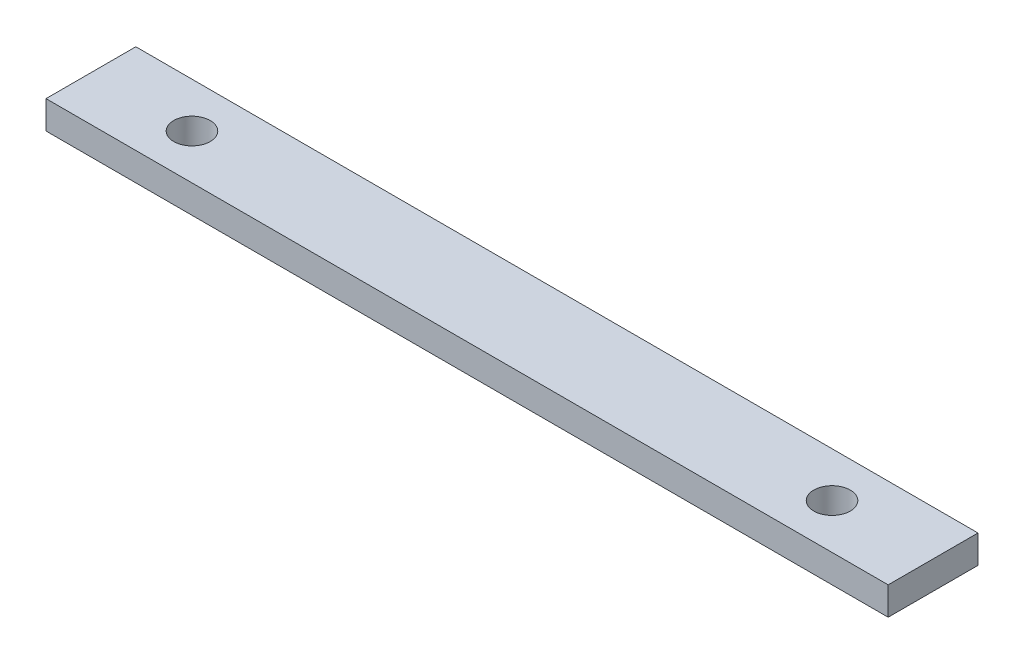
ISO-10303-21;
HEADER;
FILE_DESCRIPTION(('STEP AP214'),'2;1');
FILE_NAME('part.step','',(''),(''),'','','');
FILE_SCHEMA(('AUTOMOTIVE_DESIGN { 1 0 10303 214 1 1 1 1 }'));
ENDSEC;
DATA;
#1=APPLICATION_CONTEXT('core data for automotive mechanical design processes');
#2=APPLICATION_PROTOCOL_DEFINITION('international standard','automotive_design',2000,#1);
#3=PRODUCT_CONTEXT('',#1,'mechanical');
#4=PRODUCT('Part','Part','',(#3));
#5=PRODUCT_RELATED_PRODUCT_CATEGORY('part','',(#4));
#6=PRODUCT_DEFINITION_FORMATION('','',#4);
#7=PRODUCT_DEFINITION_CONTEXT('part definition',#1,'design');
#8=PRODUCT_DEFINITION('design','',#6,#7);
#9=PRODUCT_DEFINITION_SHAPE('','',#8);
#10=(LENGTH_UNIT() NAMED_UNIT(*) SI_UNIT(.MILLI.,.METRE.));
#11=(NAMED_UNIT(*) PLANE_ANGLE_UNIT() SI_UNIT($,.RADIAN.));
#12=(NAMED_UNIT(*) SI_UNIT($,.STERADIAN.) SOLID_ANGLE_UNIT());
#13=UNCERTAINTY_MEASURE_WITH_UNIT(LENGTH_MEASURE(1.E-05),#10,'distance_accuracy_value','');
#14=(GEOMETRIC_REPRESENTATION_CONTEXT(3) GLOBAL_UNCERTAINTY_ASSIGNED_CONTEXT((#13)) GLOBAL_UNIT_ASSIGNED_CONTEXT((#10,
#11,#12)) REPRESENTATION_CONTEXT('',''));
#15=CARTESIAN_POINT('',(0.,0.,0.));
#16=DIRECTION('',(0.,0.,1.));
#17=DIRECTION('',(1.,0.,0.));
#18=AXIS2_PLACEMENT_3D('',#15,#16,#17);
#19=CARTESIAN_POINT('',(-75.,5.,8.));
#20=DIRECTION('',(1.,0.,0.));
#21=DIRECTION('',(0.,0.,-1.));
#22=AXIS2_PLACEMENT_3D('',#19,#20,#21);
#23=PLANE('',#22);
#24=DIRECTION('',(0.,0.,1.));
#25=VECTOR('',#24,1.);
#26=CARTESIAN_POINT('',(-75.,0.,8.));
#27=LINE('',#26,#25);
#28=CARTESIAN_POINT('',(-75.,0.,-8.));
#29=VERTEX_POINT('',#28);
#30=CARTESIAN_POINT('',(-75.,0.,8.));
#31=VERTEX_POINT('',#30);
#32=EDGE_CURVE('E94',#29,#31,#27,.T.);
#33=ORIENTED_EDGE('',*,*,#32,.T.);
#34=DIRECTION('',(0.,-1.,0.));
#35=VECTOR('',#34,1.);
#36=CARTESIAN_POINT('',(-75.,5.,8.));
#37=LINE('',#36,#35);
#38=CARTESIAN_POINT('',(-75.,5.,8.));
#39=VERTEX_POINT('',#38);
#40=EDGE_CURVE('E11',#39,#31,#37,.T.);
#41=ORIENTED_EDGE('',*,*,#40,.F.);
#42=DIRECTION('',(0.,0.,1.));
#43=VECTOR('',#42,1.);
#44=CARTESIAN_POINT('',(-75.,5.,8.));
#45=LINE('',#44,#43);
#46=CARTESIAN_POINT('',(-75.,5.,-8.));
#47=VERTEX_POINT('',#46);
#48=EDGE_CURVE('E82',#47,#39,#45,.T.);
#49=ORIENTED_EDGE('',*,*,#48,.F.);
#50=DIRECTION('',(0.,-1.,0.));
#51=VECTOR('',#50,1.);
#52=CARTESIAN_POINT('',(-75.,5.,-8.));
#53=LINE('',#52,#51);
#54=EDGE_CURVE('E90',#47,#29,#53,.T.);
#55=ORIENTED_EDGE('',*,*,#54,.T.);
#56=EDGE_LOOP('',(#33,#41,#49,#55));
#57=FACE_BOUND('',#56,.T.);
#58=ADVANCED_FACE('F31',(#57),#23,.F.);
#59=CARTESIAN_POINT('',(-75.,5.,8.));
#60=DIRECTION('',(0.,0.,-1.));
#61=DIRECTION('',(-1.,0.,0.));
#62=AXIS2_PLACEMENT_3D('',#59,#60,#61);
#63=PLANE('',#62);
#64=DIRECTION('',(1.,0.,0.));
#65=VECTOR('',#64,1.);
#66=CARTESIAN_POINT('',(-75.,0.,8.));
#67=LINE('',#66,#65);
#68=CARTESIAN_POINT('',(75.,0.,8.));
#69=VERTEX_POINT('',#68);
#70=EDGE_CURVE('E86',#31,#69,#67,.T.);
#71=ORIENTED_EDGE('',*,*,#70,.T.);
#72=DIRECTION('',(0.,-1.,0.));
#73=VECTOR('',#72,1.);
#74=CARTESIAN_POINT('',(75.,5.,8.));
#75=LINE('',#74,#73);
#76=CARTESIAN_POINT('',(75.,5.,8.));
#77=VERTEX_POINT('',#76);
#78=EDGE_CURVE('E39',#77,#69,#75,.T.);
#79=ORIENTED_EDGE('',*,*,#78,.F.);
#80=DIRECTION('',(1.,0.,0.));
#81=VECTOR('',#80,1.);
#82=CARTESIAN_POINT('',(-75.,5.,8.));
#83=LINE('',#82,#81);
#84=EDGE_CURVE('E77',#39,#77,#83,.T.);
#85=ORIENTED_EDGE('',*,*,#84,.F.);
#86=ORIENTED_EDGE('',*,*,#40,.T.);
#87=EDGE_LOOP('',(#71,#79,#85,#86));
#88=FACE_BOUND('',#87,.T.);
#89=ADVANCED_FACE('F85',(#88),#63,.F.);
#90=CARTESIAN_POINT('',(75.,5.,8.));
#91=DIRECTION('',(-1.,0.,0.));
#92=DIRECTION('',(0.,0.,1.));
#93=AXIS2_PLACEMENT_3D('',#90,#91,#92);
#94=PLANE('',#93);
#95=DIRECTION('',(0.,0.,-1.));
#96=VECTOR('',#95,1.);
#97=CARTESIAN_POINT('',(75.,0.,8.));
#98=LINE('',#97,#96);
#99=CARTESIAN_POINT('',(75.,0.,-8.));
#100=VERTEX_POINT('',#99);
#101=EDGE_CURVE('E64',#69,#100,#98,.T.);
#102=ORIENTED_EDGE('',*,*,#101,.T.);
#103=DIRECTION('',(0.,-1.,0.));
#104=VECTOR('',#103,1.);
#105=CARTESIAN_POINT('',(75.,5.,-8.));
#106=LINE('',#105,#104);
#107=CARTESIAN_POINT('',(75.,5.,-8.));
#108=VERTEX_POINT('',#107);
#109=EDGE_CURVE('E87',#108,#100,#106,.T.);
#110=ORIENTED_EDGE('',*,*,#109,.F.);
#111=DIRECTION('',(0.,0.,-1.));
#112=VECTOR('',#111,1.);
#113=CARTESIAN_POINT('',(75.,5.,8.));
#114=LINE('',#113,#112);
#115=EDGE_CURVE('E80',#77,#108,#114,.T.);
#116=ORIENTED_EDGE('',*,*,#115,.F.);
#117=ORIENTED_EDGE('',*,*,#78,.T.);
#118=EDGE_LOOP('',(#102,#110,#116,#117));
#119=FACE_BOUND('',#118,.T.);
#120=ADVANCED_FACE('F88',(#119),#94,.F.);
#121=CARTESIAN_POINT('',(-75.,5.,-8.));
#122=DIRECTION('',(0.,0.,1.));
#123=DIRECTION('',(1.,0.,0.));
#124=AXIS2_PLACEMENT_3D('',#121,#122,#123);
#125=PLANE('',#124);
#126=DIRECTION('',(-1.,0.,0.));
#127=VECTOR('',#126,1.);
#128=CARTESIAN_POINT('',(-75.,0.,-8.));
#129=LINE('',#128,#127);
#130=EDGE_CURVE('E70',#100,#29,#129,.T.);
#131=ORIENTED_EDGE('',*,*,#130,.T.);
#132=ORIENTED_EDGE('',*,*,#54,.F.);
#133=DIRECTION('',(-1.,0.,0.));
#134=VECTOR('',#133,1.);
#135=CARTESIAN_POINT('',(-75.,5.,-8.));
#136=LINE('',#135,#134);
#137=EDGE_CURVE('E47',#108,#47,#136,.T.);
#138=ORIENTED_EDGE('',*,*,#137,.F.);
#139=ORIENTED_EDGE('',*,*,#109,.T.);
#140=EDGE_LOOP('',(#131,#132,#138,#139));
#141=FACE_BOUND('',#140,.T.);
#142=ADVANCED_FACE('F102',(#141),#125,.F.);
#143=CARTESIAN_POINT('',(-75.,5.,-8.));
#144=DIRECTION('',(0.,-1.,0.));
#145=DIRECTION('',(0.,0.,-1.));
#146=AXIS2_PLACEMENT_3D('',#143,#144,#145);
#147=PLANE('',#146);
#148=CARTESIAN_POINT('',(57.,5.,0.));
#149=DIRECTION('',(0.,1.,0.));
#150=DIRECTION('',(0.,0.,-1.));
#151=AXIS2_PLACEMENT_3D('',#148,#149,#150);
#152=CIRCLE('',#151,3.25000000000001);
#153=CARTESIAN_POINT('',(57.,5.,-3.25000000000001));
#154=VERTEX_POINT('',#153);
#155=EDGE_CURVE('E111',#154,#154,#152,.T.);
#156=ORIENTED_EDGE('',*,*,#155,.F.);
#157=EDGE_LOOP('',(#156));
#158=FACE_BOUND('',#157,.T.);
#159=CARTESIAN_POINT('',(-57.,5.,0.));
#160=DIRECTION('',(0.,1.,0.));
#161=DIRECTION('',(0.,0.,1.));
#162=AXIS2_PLACEMENT_3D('',#159,#160,#161);
#163=CIRCLE('',#162,3.25000000000001);
#164=CARTESIAN_POINT('',(-57.,5.,3.25000000000001));
#165=VERTEX_POINT('',#164);
#166=EDGE_CURVE('E97',#165,#165,#163,.T.);
#167=ORIENTED_EDGE('',*,*,#166,.F.);
#168=EDGE_LOOP('',(#167));
#169=FACE_BOUND('',#168,.T.);
#170=ORIENTED_EDGE('',*,*,#48,.T.);
#171=ORIENTED_EDGE('',*,*,#84,.T.);
#172=ORIENTED_EDGE('',*,*,#115,.T.);
#173=ORIENTED_EDGE('',*,*,#137,.T.);
#174=EDGE_LOOP('',(#170,#171,#172,#173));
#175=FACE_BOUND('',#174,.T.);
#176=ADVANCED_FACE('F78',(#158,#169,#175),#147,.F.);
#177=CARTESIAN_POINT('',(-75.,0.,-8.));
#178=DIRECTION('',(0.,-1.,0.));
#179=DIRECTION('',(0.,0.,-1.));
#180=AXIS2_PLACEMENT_3D('',#177,#178,#179);
#181=PLANE('',#180);
#182=CARTESIAN_POINT('',(57.,0.,0.));
#183=DIRECTION('',(0.,-1.,0.));
#184=DIRECTION('',(0.,0.,-1.));
#185=AXIS2_PLACEMENT_3D('',#182,#183,#184);
#186=CIRCLE('',#185,3.25000000000001);
#187=CARTESIAN_POINT('',(57.,0.,-3.25000000000001));
#188=VERTEX_POINT('',#187);
#189=EDGE_CURVE('E114',#188,#188,#186,.F.);
#190=ORIENTED_EDGE('',*,*,#189,.T.);
#191=EDGE_LOOP('',(#190));
#192=FACE_BOUND('',#191,.T.);
#193=CARTESIAN_POINT('',(-57.,0.,0.));
#194=DIRECTION('',(0.,-1.,0.));
#195=DIRECTION('',(0.,0.,-1.));
#196=AXIS2_PLACEMENT_3D('',#193,#194,#195);
#197=CIRCLE('',#196,3.25000000000001);
#198=CARTESIAN_POINT('',(-57.,0.,-3.25000000000001));
#199=VERTEX_POINT('',#198);
#200=EDGE_CURVE('E108',#199,#199,#197,.F.);
#201=ORIENTED_EDGE('',*,*,#200,.T.);
#202=EDGE_LOOP('',(#201));
#203=FACE_BOUND('',#202,.T.);
#204=ORIENTED_EDGE('',*,*,#32,.F.);
#205=ORIENTED_EDGE('',*,*,#130,.F.);
#206=ORIENTED_EDGE('',*,*,#101,.F.);
#207=ORIENTED_EDGE('',*,*,#70,.F.);
#208=EDGE_LOOP('',(#204,#205,#206,#207));
#209=FACE_BOUND('',#208,.T.);
#210=ADVANCED_FACE('F105',(#192,#203,#209),#181,.T.);
#211=CARTESIAN_POINT('',(-57.,-0.00100000000000013,0.));
#212=DIRECTION('',(0.,1.,0.));
#213=DIRECTION('',(0.,0.,1.));
#214=AXIS2_PLACEMENT_3D('',#211,#212,#213);
#215=CYLINDRICAL_SURFACE('',#214,3.25000000000001);
#216=ORIENTED_EDGE('',*,*,#200,.F.);
#217=EDGE_LOOP('',(#216));
#218=FACE_BOUND('',#217,.T.);
#219=ORIENTED_EDGE('',*,*,#166,.T.);
#220=EDGE_LOOP('',(#219));
#221=FACE_BOUND('',#220,.T.);
#222=ADVANCED_FACE('F127',(#218,#221),#215,.F.);
#223=CARTESIAN_POINT('',(57.,-0.00100000000000013,0.));
#224=DIRECTION('',(0.,1.,0.));
#225=DIRECTION('',(0.,0.,1.));
#226=AXIS2_PLACEMENT_3D('',#223,#224,#225);
#227=CYLINDRICAL_SURFACE('',#226,3.25000000000001);
#228=ORIENTED_EDGE('',*,*,#189,.F.);
#229=EDGE_LOOP('',(#228));
#230=FACE_BOUND('',#229,.T.);
#231=ORIENTED_EDGE('',*,*,#155,.T.);
#232=EDGE_LOOP('',(#231));
#233=FACE_BOUND('',#232,.T.);
#234=ADVANCED_FACE('F120',(#230,#233),#227,.F.);
#235=CLOSED_SHELL('',(#58,#89,#120,#142,#176,#210,#222,#234));
#236=MANIFOLD_SOLID_BREP('B2',#235);
#237=ADVANCED_BREP_SHAPE_REPRESENTATION('',(#18,#236),#14);
#238=SHAPE_DEFINITION_REPRESENTATION(#9,#237);
ENDSEC;
END-ISO-10303-21;
